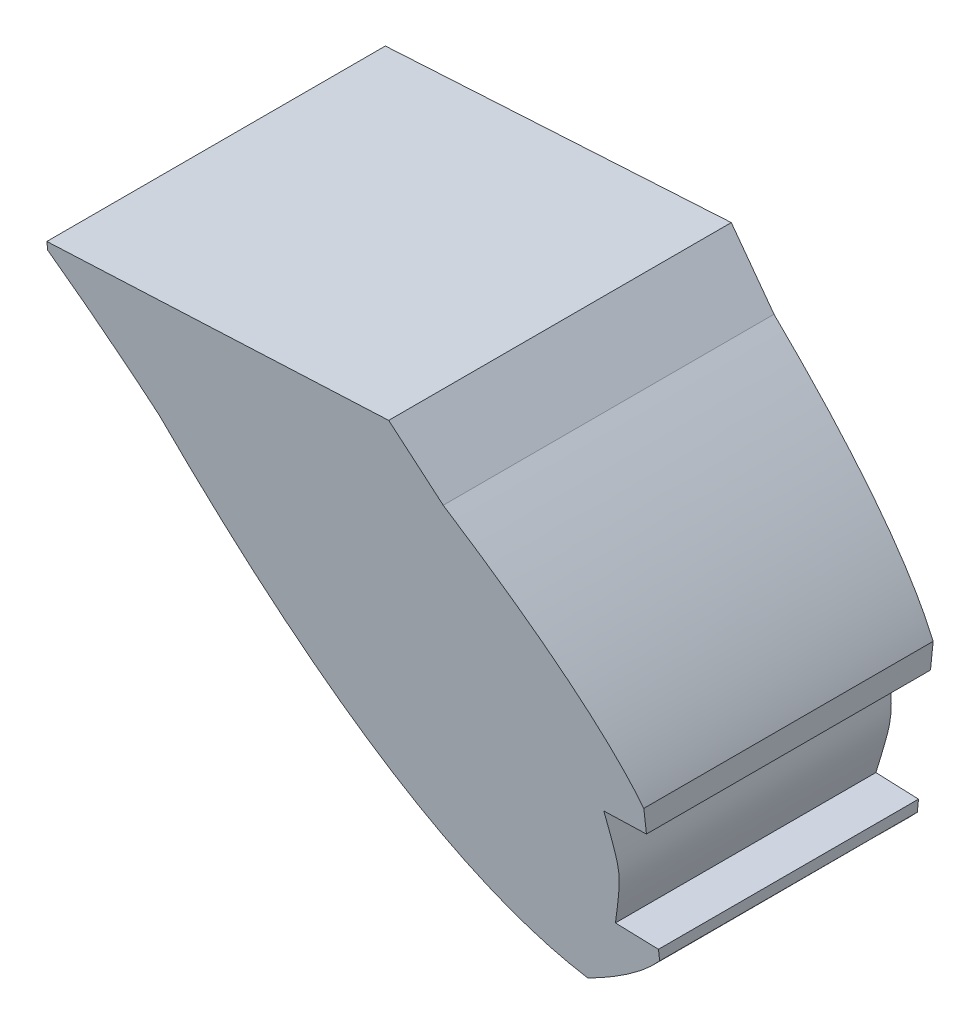
ISO-10303-21;
HEADER;
FILE_DESCRIPTION(('STEP AP214'),'2;1');
FILE_NAME('part.step','',(''),(''),'','','');
FILE_SCHEMA(('AUTOMOTIVE_DESIGN { 1 0 10303 214 1 1 1 1 }'));
ENDSEC;
DATA;
#1=APPLICATION_CONTEXT('core data for automotive mechanical design processes');
#2=APPLICATION_PROTOCOL_DEFINITION('international standard','automotive_design',2000,#1);
#3=PRODUCT_CONTEXT('',#1,'mechanical');
#4=PRODUCT('Part','Part','',(#3));
#5=PRODUCT_RELATED_PRODUCT_CATEGORY('part','',(#4));
#6=PRODUCT_DEFINITION_FORMATION('','',#4);
#7=PRODUCT_DEFINITION_CONTEXT('part definition',#1,'design');
#8=PRODUCT_DEFINITION('design','',#6,#7);
#9=PRODUCT_DEFINITION_SHAPE('','',#8);
#10=(LENGTH_UNIT() NAMED_UNIT(*) SI_UNIT(.MILLI.,.METRE.));
#11=(NAMED_UNIT(*) PLANE_ANGLE_UNIT() SI_UNIT($,.RADIAN.));
#12=(NAMED_UNIT(*) SI_UNIT($,.STERADIAN.) SOLID_ANGLE_UNIT());
#13=UNCERTAINTY_MEASURE_WITH_UNIT(LENGTH_MEASURE(1.E-05),#10,'distance_accuracy_value','');
#14=(GEOMETRIC_REPRESENTATION_CONTEXT(3) GLOBAL_UNCERTAINTY_ASSIGNED_CONTEXT((#13)) GLOBAL_UNIT_ASSIGNED_CONTEXT((#10,
#11,#12)) REPRESENTATION_CONTEXT('',''));
#15=CARTESIAN_POINT('',(0.,0.,0.));
#16=DIRECTION('',(0.,0.,1.));
#17=DIRECTION('',(1.,0.,0.));
#18=AXIS2_PLACEMENT_3D('',#15,#16,#17);
#19=CARTESIAN_POINT('',(0.355125000055651,-1.23774703808888E-13,7.));
#20=DIRECTION('',(-1.,3.48538412642003E-13,0.));
#21=DIRECTION('',(-3.48538412642003E-13,-1.,0.));
#22=AXIS2_PLACEMENT_3D('',#19,#20,#21);
#23=PLANE('',#22);
#24=DIRECTION('',(0.,-0.993653373689782,0.112485434412263));
#25=VECTOR('',#24,1.);
#26=CARTESIAN_POINT('',(0.355125000056697,12.6081551722012,-7.));
#27=LINE('',#26,#25);
#28=CARTESIAN_POINT('',(0.355125000056697,3.0015495286345,-5.91249480185305));
#29=VERTEX_POINT('',#28);
#30=CARTESIAN_POINT('',(0.355125000056447,2.03738091179555,-5.80334715682562));
#31=VERTEX_POINT('',#30);
#32=EDGE_CURVE('E60',#29,#31,#27,.T.);
#33=ORIENTED_EDGE('',*,*,#32,.F.);
#34=DIRECTION('',(0.,0.,-1.));
#35=VECTOR('',#34,1.);
#36=CARTESIAN_POINT('',(0.355125000056697,3.0015495286345,7.));
#37=LINE('',#36,#35);
#38=CARTESIAN_POINT('',(0.355125000056697,3.0015495286345,5.91249480185305));
#39=VERTEX_POINT('',#38);
#40=EDGE_CURVE('E178',#39,#29,#37,.T.);
#41=ORIENTED_EDGE('',*,*,#40,.F.);
#42=DIRECTION('',(0.,0.993653373689782,0.112485434412263));
#43=VECTOR('',#42,1.);
#44=CARTESIAN_POINT('',(0.355125000056697,12.6081551722012,7.));
#45=LINE('',#44,#43);
#46=CARTESIAN_POINT('',(0.355125000056697,2.03738091179556,5.80334715682562));
#47=VERTEX_POINT('',#46);
#48=EDGE_CURVE('E147',#47,#39,#45,.T.);
#49=ORIENTED_EDGE('',*,*,#48,.F.);
#50=DIRECTION('',(0.,0.,-1.));
#51=VECTOR('',#50,1.);
#52=CARTESIAN_POINT('',(0.355125000056447,2.03738091179555,7.));
#53=LINE('',#52,#51);
#54=EDGE_CURVE('E169',#47,#31,#53,.T.);
#55=ORIENTED_EDGE('',*,*,#54,.T.);
#56=EDGE_LOOP('',(#33,#41,#49,#55));
#57=FACE_BOUND('',#56,.T.);
#58=ADVANCED_FACE('F37',(#57),#23,.F.);
#59=CARTESIAN_POINT('',(-23.0359211456035,0.,7.));
#60=DIRECTION('',(-1.,0.,0.));
#61=DIRECTION('',(0.,0.,1.));
#62=AXIS2_PLACEMENT_3D('',#59,#60,#61);
#63=PLANE('',#62);
#64=DIRECTION('',(0.,0.,-1.));
#65=VECTOR('',#64,1.);
#66=CARTESIAN_POINT('',(-23.0359211456035,11.8716122879342,7.));
#67=LINE('',#66,#65);
#68=CARTESIAN_POINT('',(-23.0359211456035,11.8716122879342,6.91662047501294));
#69=VERTEX_POINT('',#68);
#70=CARTESIAN_POINT('',(-23.0359211456035,11.8716122879342,-6.91662047501294));
#71=VERTEX_POINT('',#70);
#72=EDGE_CURVE('E186',#69,#71,#67,.T.);
#73=ORIENTED_EDGE('',*,*,#72,.T.);
#74=DIRECTION('',(0.,-0.993653373689782,0.112485434412263));
#75=VECTOR('',#74,1.);
#76=CARTESIAN_POINT('',(-23.0359211456035,12.6081551722012,-7.));
#77=LINE('',#76,#75);
#78=CARTESIAN_POINT('',(-23.0359211456035,11.5401378200983,-6.87909627341673));
#79=VERTEX_POINT('',#78);
#80=EDGE_CURVE('E318',#71,#79,#77,.T.);
#81=ORIENTED_EDGE('',*,*,#80,.T.);
#82=DIRECTION('',(0.,0.,-1.));
#83=VECTOR('',#82,1.);
#84=CARTESIAN_POINT('',(-23.0359211456035,11.5401378200983,7.));
#85=LINE('',#84,#83);
#86=CARTESIAN_POINT('',(-23.0359211456035,11.5401378200983,6.87909627341673));
#87=VERTEX_POINT('',#86);
#88=EDGE_CURVE('E187',#87,#79,#85,.T.);
#89=ORIENTED_EDGE('',*,*,#88,.F.);
#90=DIRECTION('',(0.,0.993653373689782,0.112485434412263));
#91=VECTOR('',#90,1.);
#92=CARTESIAN_POINT('',(-23.0359211456035,12.6081551722012,7.));
#93=LINE('',#92,#91);
#94=EDGE_CURVE('E316',#87,#69,#93,.T.);
#95=ORIENTED_EDGE('',*,*,#94,.T.);
#96=EDGE_LOOP('',(#73,#81,#89,#95));
#97=FACE_BOUND('',#96,.T.);
#98=ADVANCED_FACE('F312',(#97),#63,.T.);
#99=CARTESIAN_POINT('',(-18.9451921135982,7.54091889574655,7.));
#100=CARTESIAN_POINT('',(-10.2150083842792,-3.69764410322756,7.));
#101=CARTESIAN_POINT('',(-2.84660482498738,-5.05908110388432,7.));
#102=(BOUNDED_CURVE() B_SPLINE_CURVE(2,(#99,#100,#101),.UNSPECIFIED.,.F.,
.F.) B_SPLINE_CURVE_WITH_KNOTS((3,3),(0.497667241108509,0.499554279588011),
.UNSPECIFIED.) CURVE() GEOMETRIC_REPRESENTATION_ITEM() RATIONAL_B_SPLINE_CURVE((1.,1.,1.)) REPRESENTATION_ITEM(''));
#103=DIRECTION('',(0.,0.,-1.));
#104=VECTOR('',#103,1.);
#105=SURFACE_OF_LINEAR_EXTRUSION('',#102,#104);
#106=DIRECTION('',(0.,0.,-1.));
#107=VECTOR('',#106,1.);
#108=CARTESIAN_POINT('',(-18.9451921135982,7.54091889574657,7.));
#109=LINE('',#108,#107);
#110=CARTESIAN_POINT('',(-18.9451921135982,7.54091889574657,6.42636910524442));
#111=VERTEX_POINT('',#110);
#112=CARTESIAN_POINT('',(-18.9451921135982,7.54091889574657,-6.42636910524441));
#113=VERTEX_POINT('',#112);
#114=EDGE_CURVE('E194',#111,#113,#109,.T.);
#115=ORIENTED_EDGE('',*,*,#114,.T.);
#116=CARTESIAN_POINT('',(-18.9451921135982,7.54091889574655,-6.42636910524441));
#117=CARTESIAN_POINT('',(-18.7033608655423,7.22962108931645,-6.39112898035273));
#118=CARTESIAN_POINT('',(-18.4592647140916,6.9200497206851,-6.35608429494821));
#119=CARTESIAN_POINT('',(-17.9661198805234,6.30464603742845,-6.28641819962467));
#120=CARTESIAN_POINT('',(-17.7170694462669,5.99881510969872,-6.25179694670763));
#121=CARTESIAN_POINT('',(-17.2137366178937,5.3913665824337,-6.18303140604553));
#122=CARTESIAN_POINT('',(-16.9594535947769,5.08974949683998,-6.14888717648066));
#123=CARTESIAN_POINT('',(-16.4451285665965,4.49103725761873,-6.08111061767257));
#124=CARTESIAN_POINT('',(-16.1850826962375,4.19394537928884,-6.04747865920581));
#125=CARTESIAN_POINT('',(-15.6590118901181,3.60508061675355,-5.9808168731366));
#126=CARTESIAN_POINT('',(-15.3929875534481,3.31330720485499,-5.94778698579723));
#127=CARTESIAN_POINT('',(-14.8544901847056,2.7357195544677,-5.88240181277285));
#128=CARTESIAN_POINT('',(-14.5820174931064,2.44990500284308,-5.85004649163963));
#129=CARTESIAN_POINT('',(-13.9777704357619,1.83142011947111,-5.78003159245484));
#130=CARTESIAN_POINT('',(-13.6445482479649,1.50014167377654,-5.74252958132897));
#131=CARTESIAN_POINT('',(-12.9673134934436,0.848664446736887,-5.66877982026175));
#132=CARTESIAN_POINT('',(-12.623301443116,0.528465136688492,-5.63253201046914));
#133=CARTESIAN_POINT('',(-11.9227759490938,-0.0995013958587513,-5.5614437516454));
#134=CARTESIAN_POINT('',(-11.5662405708663,-0.407244542107335,-5.52660602813964));
#135=CARTESIAN_POINT('',(-10.840142749037,-1.00720368374379,-5.45868831511867));
#136=CARTESIAN_POINT('',(-10.4705807273197,-1.29942018121482,-5.4256082687657));
#137=CARTESIAN_POINT('',(-9.71382699072171,-1.86779135556405,-5.36126643674768));
#138=CARTESIAN_POINT('',(-9.32650636654571,-2.14377746328672,-5.330023733768));
#139=CARTESIAN_POINT('',(-8.5360986768139,-2.67282289543975,-5.27013372902864));
#140=CARTESIAN_POINT('',(-8.13300835344273,-2.92587744631612,-5.24148696765387));
#141=CARTESIAN_POINT('',(-7.31201826568453,-3.40280761684766,-5.18749661363601));
#142=CARTESIAN_POINT('',(-6.89419365451789,-3.62680992502778,-5.16213867935817));
#143=CARTESIAN_POINT('',(-6.04187322097519,-4.0405536088069,-5.11530128189388));
#144=CARTESIAN_POINT('',(-5.60738935372736,-4.23031901573022,-5.09381909826786));
#145=CARTESIAN_POINT('',(-4.78985442909107,-4.54236533838515,-5.05849423842238));
#146=CARTESIAN_POINT('',(-4.4091055725695,-4.67052923075731,-5.04398558631979));
#147=CARTESIAN_POINT('',(-3.82960691198316,-4.83674345690554,-5.02516948814227));
#148=CARTESIAN_POINT('',(-3.63462104960687,-4.8878904691115,-5.01937944702812));
#149=CARTESIAN_POINT('',(-3.24229120544362,-4.9807402777546,-5.00886848683127));
#150=CARTESIAN_POINT('',(-3.0449461414238,-5.02243854990591,-5.00414807991536));
#151=CARTESIAN_POINT('',(-2.84660482498738,-5.05908110388432,-5.));
#152=B_SPLINE_CURVE_WITH_KNOTS('',3,(#116,#117,#118,#119,#120,#121,#122,#123,#124,#125,#126,
#127,#128,#129,#130,#131,#132,#133,#134,#135,#136,#137,#138,#139,#140,#141,#142,#143,#144,#145,
#146,#147,#148,#149,#150,#151),.UNSPECIFIED.,.F.,.F.,(4,2,2,2,2,2,2,2,2,2,2,2,2,2,2,2,2,4),(0.,
1.1872997216569,2.37502708567824,3.56289806807204,4.75159146291787,5.94016626761519,
7.12867845491362,8.54255640265696,9.95636678593971,11.3727907462706,12.7891688759803,
14.2183172044781,15.6477623519031,17.0707480146133,18.4927309460623,19.6971402338765,
20.3019233237111,20.9069953892921),.UNSPECIFIED.);
#153=CARTESIAN_POINT('',(-2.84660482498738,-5.05908110388432,-5.));
#154=VERTEX_POINT('',#153);
#155=EDGE_CURVE('E251',#113,#154,#152,.T.);
#156=ORIENTED_EDGE('',*,*,#155,.T.);
#157=DIRECTION('',(0.,0.,-1.));
#158=VECTOR('',#157,1.);
#159=CARTESIAN_POINT('',(-2.84660482498738,-5.05908110388432,7.));
#160=LINE('',#159,#158);
#161=CARTESIAN_POINT('',(-2.84660482498738,-5.05908110388432,5.));
#162=VERTEX_POINT('',#161);
#163=EDGE_CURVE('E154',#162,#154,#160,.T.);
#164=ORIENTED_EDGE('',*,*,#163,.F.);
#165=CARTESIAN_POINT('',(-2.84660482498738,-5.05908110388432,5.));
#166=CARTESIAN_POINT('',(-3.0836355452615,-5.01529762547054,5.00495646039138));
#167=CARTESIAN_POINT('',(-3.31925014057108,-4.96428184629726,5.01073164541478));
#168=CARTESIAN_POINT('',(-3.78628189704186,-4.84911384389608,5.02376911212451));
#169=CARTESIAN_POINT('',(-4.01771143135529,-4.78501130060695,5.03102576984815));
#170=CARTESIAN_POINT('',(-4.47638324853452,-4.64477679089168,5.04690086287615));
#171=CARTESIAN_POINT('',(-4.70363211310207,-4.56866593727755,5.05551690812791));
#172=CARTESIAN_POINT('',(-5.15398016115681,-4.40545252874729,5.07399330205617));
#173=CARTESIAN_POINT('',(-5.37708095327682,-4.31835434125152,5.08385315632366));
#174=CARTESIAN_POINT('',(-5.81545834234536,-4.13567110279715,5.10453361087802));
#175=CARTESIAN_POINT('',(-6.03080317783365,-4.04024711994086,5.11533597762798));
#176=CARTESIAN_POINT('',(-6.45748946905634,-3.84057736608456,5.13793937192646));
#177=CARTESIAN_POINT('',(-6.66882789943329,-3.73632522989765,5.14974112003892));
#178=CARTESIAN_POINT('',(-7.08747417766979,-3.51983158147829,5.17424904476877));
#179=CARTESIAN_POINT('',(-7.29477947597257,-3.40758521204135,5.18695577124062));
#180=CARTESIAN_POINT('',(-7.70530843131035,-3.17590609220346,5.21318275051655));
#181=CARTESIAN_POINT('',(-7.90853147430462,-3.0564722713248,5.22670312450288));
#182=CARTESIAN_POINT('',(-8.45410340689061,-2.72385368196738,5.26435684511426));
#183=CARTESIAN_POINT('',(-8.79259906035209,-2.50440768840731,5.28919898682003));
#184=CARTESIAN_POINT('',(-9.45845448583479,-2.04949644973372,5.3406967119384));
#185=CARTESIAN_POINT('',(-9.78581359629267,-1.81403025542841,5.3673524028032));
#186=CARTESIAN_POINT('',(-10.4302582396863,-1.32938575303013,5.42221604925302));
#187=CARTESIAN_POINT('',(-10.7473396395034,-1.08020203459831,5.45042461730948));
#188=CARTESIAN_POINT('',(-11.3718438106499,-0.570176876647104,5.50816145288252));
#189=CARTESIAN_POINT('',(-11.6792662750814,-0.309335067346119,5.53768976225981));
#190=CARTESIAN_POINT('',(-12.2887351366992,0.225514030316342,5.59823676455314));
#191=CARTESIAN_POINT('',(-12.5906756597182,0.499640146613562,5.62926890925461));
#192=CARTESIAN_POINT('',(-13.1859914625247,1.05668157973797,5.69232817041119));
#193=CARTESIAN_POINT('',(-13.4793699933214,1.33959347409339,5.72435489942917));
#194=CARTESIAN_POINT('',(-14.0582984741035,1.91313890151101,5.78928247705987));
#195=CARTESIAN_POINT('',(-14.3438493181123,2.20377154523463,5.82218322499598));
#196=CARTESIAN_POINT('',(-14.9077244427009,2.7918210558895,5.88875272137508));
#197=CARTESIAN_POINT('',(-15.1860493084316,3.08923736980037,5.92242140721399));
#198=CARTESIAN_POINT('',(-15.7683607406539,3.72540309630891,5.99443784674841));
#199=CARTESIAN_POINT('',(-16.0715178451228,4.06490144250158,6.03287038264566));
#200=CARTESIAN_POINT('',(-16.6701836985208,4.7504922746204,6.11048193675692));
#201=CARTESIAN_POINT('',(-16.9656923307507,5.09658486102068,6.14966096634501));
#202=CARTESIAN_POINT('',(-17.4495199616275,5.67490501691598,6.21512906184765));
#203=CARTESIAN_POINT('',(-17.6398456690967,5.90547984199544,6.24123103065322));
#204=CARTESIAN_POINT('',(-18.0176052393411,6.36895711711416,6.29369846448112));
#205=CARTESIAN_POINT('',(-18.205039097963,6.60185957049552,6.3200639298818));
#206=CARTESIAN_POINT('',(-18.5771476687389,7.06981539005112,6.37303835239394));
#207=CARTESIAN_POINT('',(-18.7618224957771,7.30486866600559,6.39964729929217));
#208=CARTESIAN_POINT('',(-18.9451921135982,7.54091889574655,6.42636910524441));
#209=B_SPLINE_CURVE_WITH_KNOTS('',3,(#165,#166,#167,#168,#169,#170,#171,#172,#173,#174,#175,
#176,#177,#178,#179,#180,#181,#182,#183,#184,#185,#186,#187,#188,#189,#190,#191,#192,#193,#194,
#195,#196,#197,#198,#199,#200,#201,#202,#203,#204,#205,#206,#207,#208),.UNSPECIFIED.,.F.,.F.,(4,
2,2,2,2,2,2,2,2,2,2,2,2,2,2,2,2,2,2,2,2,4),(0.,0.723070627629283,1.44344574109941,
2.16256813451498,2.88140557514503,3.58855192345824,4.2962125448096,5.0043068623572,
5.71250690363926,6.92441762508089,8.13640021448464,9.3488642962315,10.5613668633146,
11.788141520998,13.0144441434254,14.2406061176645,15.4666684871313,16.8368576095009,
18.2070676256843,19.1073954524656,20.0077245721621,20.9080160976373),.UNSPECIFIED.);
#210=EDGE_CURVE('E133',#162,#111,#209,.T.);
#211=ORIENTED_EDGE('',*,*,#210,.T.);
#212=EDGE_LOOP('',(#115,#156,#164,#211));
#213=FACE_BOUND('',#212,.T.);
#214=ADVANCED_FACE('F45',(#213),#105,.F.);
#215=CARTESIAN_POINT('',(-2.84660482498738,-5.05908110388432,7.));
#216=CARTESIAN_POINT('',(-0.742366881974002,-3.93520659958673,7.));
#217=CARTESIAN_POINT('',(0.355124999965198,-2.72325322699678,7.));
#218=(BOUNDED_CURVE() B_SPLINE_CURVE(2,(#215,#216,#217),.UNSPECIFIED.,.F.,
.F.) B_SPLINE_CURVE_WITH_KNOTS((3,3),(0.498812074629495,0.499412845463797),
.UNSPECIFIED.) CURVE() GEOMETRIC_REPRESENTATION_ITEM() RATIONAL_B_SPLINE_CURVE((1.,1.,1.)) REPRESENTATION_ITEM(''));
#219=DIRECTION('',(0.,0.,-1.));
#220=VECTOR('',#219,1.);
#221=SURFACE_OF_LINEAR_EXTRUSION('',#218,#220);
#222=ORIENTED_EDGE('',*,*,#163,.T.);
#223=CARTESIAN_POINT('',(-2.84660482498738,-5.05908110388432,-5.));
#224=CARTESIAN_POINT('',(-2.67154367534484,-4.96554243060771,-5.01058894235803));
#225=CARTESIAN_POINT('',(-2.49778385523126,-4.86952307483158,-5.02145870764284));
#226=CARTESIAN_POINT('',(-2.15332890723938,-4.67164155861341,-5.04385966647148));
#227=CARTESIAN_POINT('',(-1.9826387176766,-4.56977092703724,-5.05539181898071));
#228=CARTESIAN_POINT('',(-1.64527137465746,-4.35955519460265,-5.0791890591545));
#229=CARTESIAN_POINT('',(-1.47859514121983,-4.25120862887406,-5.09145431264808));
#230=CARTESIAN_POINT('',(-1.15044448784201,-4.02724001195876,-5.11680843294344));
#231=CARTESIAN_POINT('',(-0.98896568487432,-3.911624347545,-5.12989657673763));
#232=CARTESIAN_POINT('',(-0.724614348138144,-3.7114805449727,-5.15255363519824));
#233=CARTESIAN_POINT('',(-0.619967455079453,-3.6292658395869,-5.16186066025876));
#234=CARTESIAN_POINT('',(-0.414118763296717,-3.46070156785231,-5.18094279275538));
#235=CARTESIAN_POINT('',(-0.312916415666604,-3.3743526656372,-5.19071782500895));
#236=CARTESIAN_POINT('',(-0.114288127047668,-3.19685300163986,-5.21081147873311));
#237=CARTESIAN_POINT('',(-0.0168745915935635,-3.10568844995875,-5.221131661274));
#238=CARTESIAN_POINT('',(0.173044677325634,-2.91833195578561,-5.24234114658855));
#239=CARTESIAN_POINT('',(0.265547074526193,-2.82213668167119,-5.25323082651485));
#240=CARTESIAN_POINT('',(0.355124999965198,-2.72325322699678,-5.26442481895704));
#241=B_SPLINE_CURVE_WITH_KNOTS('',3,(#223,#224,#225,#226,#227,#228,#229,#230,#231,#232,#233,
#234,#235,#236,#237,#238,#239,#240),.UNSPECIFIED.,.F.,.F.,(4,2,2,2,2,2,2,2,4),(0.,
0.596333361221147,1.19355295493407,1.79090815604603,2.38774565156578,2.78786762990545,
3.18792554534165,3.58919872466333,3.99074110013676),.UNSPECIFIED.);
#242=CARTESIAN_POINT('',(0.355125000010947,-2.72325322699678,-5.26442481895704));
#243=VERTEX_POINT('',#242);
#244=EDGE_CURVE('E152',#154,#243,#241,.T.);
#245=ORIENTED_EDGE('',*,*,#244,.T.);
#246=DIRECTION('',(0.,0.,-1.));
#247=VECTOR('',#246,1.);
#248=CARTESIAN_POINT('',(0.355124999965198,-2.72325322699678,7.));
#249=LINE('',#248,#247);
#250=CARTESIAN_POINT('',(0.355125000010947,-2.72325322699678,5.26442481895704));
#251=VERTEX_POINT('',#250);
#252=EDGE_CURVE('E148',#251,#243,#249,.T.);
#253=ORIENTED_EDGE('',*,*,#252,.F.);
#254=CARTESIAN_POINT('',(0.355124999965198,-2.72325322699678,5.26442481895704));
#255=CARTESIAN_POINT('',(0.288265800066398,-2.79707578870119,5.25606781726749));
#256=CARTESIAN_POINT('',(0.219762299322532,-2.86939557158838,5.24788093599675));
#257=CARTESIAN_POINT('',(0.0798741499126208,-3.0111837154317,5.23182996553057));
#258=CARTESIAN_POINT('',(0.00849051694650469,-3.08065306448068,5.22396576447915));
#259=CARTESIAN_POINT('',(-0.209110404202349,-3.28478130911614,5.20085765164865));
#260=CARTESIAN_POINT('',(-0.359086186155244,-3.41549544786354,5.18606030171743));
#261=CARTESIAN_POINT('',(-0.666431647279958,-3.66745151891472,5.15753789253991));
#262=CARTESIAN_POINT('',(-0.823790135326829,-3.78870709059741,5.14381128926277));
#263=CARTESIAN_POINT('',(-1.14463764434189,-4.02329424679429,5.11725510893767));
#264=CARTESIAN_POINT('',(-1.30813354467851,-4.13661650521983,5.10442658763929));
#265=CARTESIAN_POINT('',(-1.58497175174893,-4.31986712055689,5.08368190381061));
#266=CARTESIAN_POINT('',(-1.69701528140079,-4.39175032218513,5.07554444523986));
#267=CARTESIAN_POINT('',(-1.92294333828473,-4.53261962763427,5.05959749086083));
#268=CARTESIAN_POINT('',(-2.03682799400811,-4.6016055280346,5.05178801808056));
#269=CARTESIAN_POINT('',(-2.26591352019373,-4.73675126913538,5.03648899349189));
#270=CARTESIAN_POINT('',(-2.38111062922232,-4.80291742324192,5.02899872698133));
#271=CARTESIAN_POINT('',(-2.6128736149529,-4.93278949726635,5.01429670205848));
#272=CARTESIAN_POINT('',(-2.72943923096306,-4.99649587614853,5.00708489168965));
#273=CARTESIAN_POINT('',(-2.84660482498738,-5.05908110388432,5.));
#274=B_SPLINE_CURVE_WITH_KNOTS('',3,(#254,#255,#256,#257,#258,#259,#260,#261,#262,#263,#264,
#265,#266,#267,#268,#269,#270,#271,#272,#273),.UNSPECIFIED.,.F.,.F.,(4,2,2,2,2,2,2,2,2,4),(0.,
0.299782926841572,0.599461041577767,1.1974499434567,1.79455995327913,2.39236050766276,
2.79242459253001,3.19251671924541,3.59166012626068,3.99072869445439),.UNSPECIFIED.);
#275=EDGE_CURVE('E126',#251,#162,#274,.T.);
#276=ORIENTED_EDGE('',*,*,#275,.T.);
#277=EDGE_LOOP('',(#222,#245,#253,#276));
#278=FACE_BOUND('',#277,.T.);
#279=ADVANCED_FACE('F153',(#278),#221,.F.);
#280=CARTESIAN_POINT('',(0.355125000532009,-7.39148800447813E-11,7.));
#281=DIRECTION('',(1.,-2.08137641489758E-10,0.));
#282=DIRECTION('',(2.08137641489758E-10,1.,0.));
#283=AXIS2_PLACEMENT_3D('',#280,#281,#282);
#284=PLANE('',#283);
#285=CARTESIAN_POINT('',(0.355125000056697,-2.28484178142546,-5.31405470319249));
#286=VERTEX_POINT('',#285);
#287=EDGE_CURVE('E149',#286,#243,#27,.T.);
#288=ORIENTED_EDGE('',*,*,#287,.F.);
#289=DIRECTION('',(0.,0.,-1.));
#290=VECTOR('',#289,1.);
#291=CARTESIAN_POINT('',(0.355125000056447,-2.28484178142545,7.));
#292=LINE('',#291,#290);
#293=CARTESIAN_POINT('',(0.355125000056697,-2.28484178142546,5.31405470319249));
#294=VERTEX_POINT('',#293);
#295=EDGE_CURVE('E146',#294,#286,#292,.T.);
#296=ORIENTED_EDGE('',*,*,#295,.F.);
#297=EDGE_CURVE('E134',#251,#294,#45,.T.);
#298=ORIENTED_EDGE('',*,*,#297,.F.);
#299=ORIENTED_EDGE('',*,*,#252,.T.);
#300=EDGE_LOOP('',(#288,#296,#298,#299));
#301=FACE_BOUND('',#300,.T.);
#302=ADVANCED_FACE('F144',(#301),#284,.T.);
#303=CARTESIAN_POINT('',(-0.0792587195419091,-2.26967276768239,7.));
#304=DIRECTION('',(-0.0348994967024901,-0.999390827019096,0.));
#305=DIRECTION('',(0.999390827019096,-0.0348994967024901,0.));
#306=AXIS2_PLACEMENT_3D('',#303,#304,#305);
#307=PLANE('',#306);
#308=ORIENTED_EDGE('',*,*,#295,.T.);
#309=DIRECTION('',(-0.999383027616045,0.034899224341334,-0.00395072820626436));
#310=VECTOR('',#309,1.);
#311=CARTESIAN_POINT('',(-0.0306324717090319,-2.27137083367421,-5.31557966697752));
#312=LINE('',#311,#310);
#313=CARTESIAN_POINT('',(-1.39487499994356,-2.22373043481491,-5.32097274579469));
#314=VERTEX_POINT('',#313);
#315=EDGE_CURVE('E298',#286,#314,#312,.T.);
#316=ORIENTED_EDGE('',*,*,#315,.T.);
#317=DIRECTION('',(0.,0.,-1.));
#318=VECTOR('',#317,1.);
#319=CARTESIAN_POINT('',(-1.39487499994356,-2.22373043481491,7.));
#320=LINE('',#319,#318);
#321=CARTESIAN_POINT('',(-1.39487499994356,-2.22373043481491,5.3209727457947));
#322=VERTEX_POINT('',#321);
#323=EDGE_CURVE('E158',#322,#314,#320,.T.);
#324=ORIENTED_EDGE('',*,*,#323,.F.);
#325=DIRECTION('',(0.999383027616045,-0.034899224341334,-0.00395072820626436));
#326=VECTOR('',#325,1.);
#327=CARTESIAN_POINT('',(-0.0859085417339361,-2.26944055077446,5.31579818252456));
#328=LINE('',#327,#326);
#329=EDGE_CURVE('E321',#322,#294,#328,.T.);
#330=ORIENTED_EDGE('',*,*,#329,.T.);
#331=EDGE_LOOP('',(#308,#316,#324,#330));
#332=FACE_BOUND('',#331,.T.);
#333=ADVANCED_FACE('F335',(#332),#307,.F.);
#334=CARTESIAN_POINT('',(-1.39487499994356,-2.22373043481491,7.));
#335=CARTESIAN_POINT('',(-0.907530669798052,-0.123730434814926,7.));
#336=CARTESIAN_POINT('',(-1.39487499994356,1.976269565185,7.));
#337=(BOUNDED_CURVE() B_SPLINE_CURVE(2,(#334,#335,#336),.UNSPECIFIED.,.F.,
.F.) B_SPLINE_CURVE_WITH_KNOTS((3,3),(0.,1.),
.UNSPECIFIED.) CURVE() GEOMETRIC_REPRESENTATION_ITEM() RATIONAL_B_SPLINE_CURVE((1.,
3.23180121851367,1.)) REPRESENTATION_ITEM(''));
#338=DIRECTION('',(0.,0.,-1.));
#339=VECTOR('',#338,1.);
#340=SURFACE_OF_LINEAR_EXTRUSION('',#337,#339);
#341=ORIENTED_EDGE('',*,*,#323,.T.);
#342=CARTESIAN_POINT('',(-1.39487499994356,-2.22373043481491,-5.32097274579469));
#343=CARTESIAN_POINT('',(-1.38202447122813,-2.16835021356968,-5.32724200266994));
#344=CARTESIAN_POINT('',(-1.36921744547373,-2.11295996104296,-5.33351239512535));
#345=CARTESIAN_POINT('',(-1.34371955909939,-2.00215267308472,-5.34605621196536));
#346=CARTESIAN_POINT('',(-1.33102869927897,-1.94673563747162,-5.35232963637053));
#347=CARTESIAN_POINT('',(-1.30579250980865,-1.83586894873068,-5.36488017761064));
#348=CARTESIAN_POINT('',(-1.29324717983284,-1.78041929567618,-5.37115729443729));
#349=CARTESIAN_POINT('',(-1.26834035470031,-1.66945670178657,-5.383718692514));
#350=CARTESIAN_POINT('',(-1.25597893242913,-1.61394374477822,-5.39000297559494));
#351=CARTESIAN_POINT('',(-1.23150428056634,-1.50286329328951,-5.40257771561119));
#352=CARTESIAN_POINT('',(-1.21939105277074,-1.44729579841754,-5.40886817259083));
#353=CARTESIAN_POINT('',(-1.19550012207595,-1.33608743052918,-5.42145739324204));
#354=CARTESIAN_POINT('',(-1.1837224309966,-1.2804465549999,-5.42775615719808));
#355=CARTESIAN_POINT('',(-1.15485704104805,-1.14125615214793,-5.44351305326002));
#356=CARTESIAN_POINT('',(-1.13805530724695,-1.05764770999797,-5.45297785475397));
#357=CARTESIAN_POINT('',(-1.10616760722362,-0.890046794372653,-5.47195093158457));
#358=CARTESIAN_POINT('',(-1.09108267359643,-0.806054121054038,-5.48145922954426));
#359=CARTESIAN_POINT('',(-1.06839764881353,-0.664871544058104,-5.49744164748328));
#360=CARTESIAN_POINT('',(-1.05995626751594,-0.607817685780514,-5.50390036659317));
#361=CARTESIAN_POINT('',(-1.04516806244473,-0.493450404650503,-5.51684718853439));
#362=CARTESIAN_POINT('',(-1.03882061818002,-0.436137063802354,-5.52333528208253));
#363=CARTESIAN_POINT('',(-1.02903068414648,-0.321308074689071,-5.53633437116685));
#364=CARTESIAN_POINT('',(-1.02558541499307,-0.263792673078833,-5.54284533878074));
#365=CARTESIAN_POINT('',(-1.02222407231355,-0.148714957691158,-5.55587258464867));
#366=CARTESIAN_POINT('',(-1.02230420900467,-0.0911527608046732,-5.56238884967019));
#367=CARTESIAN_POINT('',(-1.02596900528622,0.0239015023985966,-5.57541344065945));
#368=CARTESIAN_POINT('',(-1.02955657044098,0.0813934710005595,-5.58192175556548));
#369=CARTESIAN_POINT('',(-1.03959132289802,0.196133385303809,-5.59491076103416));
#370=CARTESIAN_POINT('',(-1.04603929917214,0.253381259276288,-5.60139144347683));
#371=CARTESIAN_POINT('',(-1.05997220439613,0.35983137212623,-5.6134420111136));
#372=CARTESIAN_POINT('',(-1.06719667195452,0.409068491171902,-5.61901584487869));
#373=CARTESIAN_POINT('',(-1.08274764683563,0.507347946837772,-5.63014146227917));
#374=CARTESIAN_POINT('',(-1.0910737056158,0.556390354412903,-5.63569325394695));
#375=CARTESIAN_POINT('',(-1.10853037258208,0.654424381213792,-5.64679108784343));
#376=CARTESIAN_POINT('',(-1.11766242226862,0.703415744133191,-5.65233710105724));
#377=CARTESIAN_POINT('',(-1.1364977866421,0.801294033672847,-5.6634173048888));
#378=CARTESIAN_POINT('',(-1.14620115522269,0.850180949988233,-5.66895149433999));
#379=CARTESIAN_POINT('',(-1.16833495400599,0.959258362431623,-5.68129948252998));
#380=CARTESIAN_POINT('',(-1.1808737668477,1.01942705832357,-5.68811081339709));
#381=CARTESIAN_POINT('',(-1.20639174214038,1.13967062360228,-5.70172285360526));
#382=CARTESIAN_POINT('',(-1.21937089694786,1.19974549459873,-5.70852356312855));
#383=CARTESIAN_POINT('',(-1.24564626429316,1.31982703510014,-5.72211726150049));
#384=CARTESIAN_POINT('',(-1.2589424791072,1.37983370411223,-5.72891025029334));
#385=CARTESIAN_POINT('',(-1.28569888355067,1.49948275843749,-5.74245498954463));
#386=CARTESIAN_POINT('',(-1.29915785770072,1.55912541262012,-5.74920677044014));
#387=CARTESIAN_POINT('',(-1.32625009614692,1.67837055204035,-5.76270578495002));
#388=CARTESIAN_POINT('',(-1.33988335761136,1.73797303791406,-5.76945301863641));
#389=CARTESIAN_POINT('',(-1.36728618039678,1.85714403003134,-5.78294363938264));
#390=CARTESIAN_POINT('',(-1.381055735056,1.91671253778666,-5.7896870266136));
#391=CARTESIAN_POINT('',(-1.39487499994356,1.976269565185,-5.79642911422342));
#392=B_SPLINE_CURVE_WITH_KNOTS('',3,(#342,#343,#344,#345,#346,#347,#348,#349,#350,#351,#352,
#353,#354,#355,#356,#357,#358,#359,#360,#361,#362,#363,#364,#365,#366,#367,#368,#369,#370,#371,
#372,#373,#374,#375,#376,#377,#378,#379,#380,#381,#382,#383,#384,#385,#386,#387,#388,#389,#390,
#391),.UNSPECIFIED.,.F.,.F.,(4,2,2,2,2,2,2,2,2,2,2,2,2,2,2,2,2,2,2,2,2,2,2,2,4),(0.,
0.171588763273453,0.343178706622211,0.514768265617104,0.686424107910212,0.858081191922478,
1.02974431538338,1.28714724145325,1.54470417716685,1.71878537631805,1.8928149439917,
2.06667765516018,2.24035346989174,2.41417328020677,2.58804106414591,2.73825198714263,
2.88840193486919,3.03882608638502,3.18926445051695,3.37477476712053,3.56028186526787,
3.74579029559563,3.93033206952695,4.11487084894101,4.29940065253389),.UNSPECIFIED.);
#393=CARTESIAN_POINT('',(-1.39487499994356,1.976269565185,-5.79642911422342));
#394=VERTEX_POINT('',#393);
#395=EDGE_CURVE('E172',#314,#394,#392,.T.);
#396=ORIENTED_EDGE('',*,*,#395,.T.);
#397=DIRECTION('',(0.,0.,-1.));
#398=VECTOR('',#397,1.);
#399=CARTESIAN_POINT('',(-1.39487499994356,1.976269565185,7.));
#400=LINE('',#399,#398);
#401=CARTESIAN_POINT('',(-1.39487499994356,1.976269565185,5.79642911422342));
#402=VERTEX_POINT('',#401);
#403=EDGE_CURVE('E167',#402,#394,#400,.T.);
#404=ORIENTED_EDGE('',*,*,#403,.F.);
#405=CARTESIAN_POINT('',(-1.39487499994356,1.976269565185,5.79642911422342));
#406=CARTESIAN_POINT('',(-1.37907511533365,1.90817072448153,5.78872006005792));
#407=CARTESIAN_POINT('',(-1.36333836969219,1.84005724657732,5.78100934890426));
#408=CARTESIAN_POINT('',(-1.33204781411177,1.703774616767,5.76558162408294));
#409=CARTESIAN_POINT('',(-1.31649404111311,1.63560545649229,5.75786460946793));
#410=CARTESIAN_POINT('',(-1.28563112684324,1.49920642241426,5.74242370722985));
#411=CARTESIAN_POINT('',(-1.27032200601989,1.43097654403409,5.73469981908867));
#412=CARTESIAN_POINT('',(-1.2399275173513,1.29390485970128,5.71918277022027));
#413=CARTESIAN_POINT('',(-1.22484485449072,1.22506245970345,5.71138954224482));
#414=CARTESIAN_POINT('',(-1.19518112320204,1.0872751663326,5.69579148364441));
#415=CARTESIAN_POINT('',(-1.18060002365467,1.01833027959621,5.68798665377074));
#416=CARTESIAN_POINT('',(-1.1521828568661,0.880291295746957,5.67236010282727));
#417=CARTESIAN_POINT('',(-1.13834675067045,0.81119720663251,5.66453838266293));
#418=CARTESIAN_POINT('',(-1.11516473949854,0.690174385789182,5.65083812768789));
#419=CARTESIAN_POINT('',(-1.10556404533104,0.638294159941606,5.64496508393199));
#420=CARTESIAN_POINT('',(-1.08728934318226,0.534373551286744,5.6332008660282));
#421=CARTESIAN_POINT('',(-1.07861528667302,0.482333177013413,5.62730969284637));
#422=CARTESIAN_POINT('',(-1.06260440200736,0.378149691610768,5.61551571627023));
#423=CARTESIAN_POINT('',(-1.05526500549272,0.326006977236309,5.60961295779011));
#424=CARTESIAN_POINT('',(-1.04244257361275,0.221494061638693,5.59778168843203));
#425=CARTESIAN_POINT('',(-1.03695934618146,0.169123884520429,5.59185318028283));
#426=CARTESIAN_POINT('',(-1.02917052981484,0.0729301509045448,5.58096367474698));
#427=CARTESIAN_POINT('',(-1.02648754730517,0.0291375389214666,5.57600618039996));
#428=CARTESIAN_POINT('',(-1.02311803398459,-0.0585228047861236,5.56608268785843));
#429=CARTESIAN_POINT('',(-1.02243133042271,-0.10239052968188,5.56111669043696));
#430=CARTESIAN_POINT('',(-1.02313587995194,-0.190112899664059,5.55118617627941));
#431=CARTESIAN_POINT('',(-1.02452732528276,-0.233967543165022,5.54622165972282));
#432=CARTESIAN_POINT('',(-1.02922830316647,-0.321575626235211,5.53630408328911));
#433=CARTESIAN_POINT('',(-1.03253802615093,-0.365329055323649,5.53135102459847));
#434=CARTESIAN_POINT('',(-1.04481913269156,-0.496026010219698,5.51655561994619));
#435=CARTESIAN_POINT('',(-1.05614963950478,-0.582745183351363,5.50673867158183));
#436=CARTESIAN_POINT('',(-1.08246686740171,-0.755641929816293,5.48716608606103));
#437=CARTESIAN_POINT('',(-1.09745579058543,-0.84181914476287,5.47741048947536));
#438=CARTESIAN_POINT('',(-1.129420439335,-1.01366509487317,5.45795685819712));
#439=CARTESIAN_POINT('',(-1.14639302616418,-1.09933441387988,5.44825875741124));
#440=CARTESIAN_POINT('',(-1.18149622255001,-1.27039766561497,5.42889373063944));
#441=CARTESIAN_POINT('',(-1.19962634896168,-1.35579169781193,5.41922679339328));
#442=CARTESIAN_POINT('',(-1.24641099322308,-1.57177275123237,5.39477689641502));
#443=CARTESIAN_POINT('',(-1.2755379218154,-1.70225834502177,5.38000541866374));
#444=CARTESIAN_POINT('',(-1.31987060164556,-1.89787014932725,5.35786140006925));
#445=CARTESIAN_POINT('',(-1.33475842772637,-1.96306843680887,5.35048069983263));
#446=CARTESIAN_POINT('',(-1.36470186719661,-2.09342597092531,5.33572371893541));
#447=CARTESIAN_POINT('',(-1.37975747811874,-2.15858521811941,5.32834743821149));
#448=CARTESIAN_POINT('',(-1.39487499994356,-2.22373043481491,5.3209727457947));
#449=B_SPLINE_CURVE_WITH_KNOTS('',3,(#405,#406,#407,#408,#409,#410,#411,#412,#413,#414,#415,
#416,#417,#418,#419,#420,#421,#422,#423,#424,#425,#426,#427,#428,#429,#430,#431,#432,#433,#434,
#435,#436,#437,#438,#439,#440,#441,#442,#443,#444,#445,#446,#447,#448),.UNSPECIFIED.,.F.,.F.,(4,
2,2,2,2,2,2,2,2,2,2,2,2,2,2,2,2,2,2,2,2,4),(0.,0.210994688118994,0.422031267037357,
0.633085392962154,0.845798629208893,1.05849864386888,1.27118752598179,1.4304428147189,
1.58968975917224,1.7486269361582,1.90754766218714,2.03996993828288,2.1723807546786,
2.30480382052941,2.43724003455642,2.70109168787962,2.96510255404672,3.22870119353187,
3.49219051999256,3.89571487778355,4.09756249770236,4.29940715332609),.UNSPECIFIED.);
#450=EDGE_CURVE('E63',#402,#322,#449,.T.);
#451=ORIENTED_EDGE('',*,*,#450,.T.);
#452=EDGE_LOOP('',(#341,#396,#404,#451));
#453=FACE_BOUND('',#452,.T.);
#454=ADVANCED_FACE('F175',(#453),#340,.F.);
#455=CARTESIAN_POINT('',(0.355125000056697,3.0015495286345,7.));
#456=CARTESIAN_POINT('',(-1.44872627004384,6.0584273141466,7.));
#457=CARTESIAN_POINT('',(-6.99487502582887,10.4773899922143,7.));
#458=(BOUNDED_CURVE() B_SPLINE_CURVE(2,(#455,#456,#457),.UNSPECIFIED.,.F.,
.F.) B_SPLINE_CURVE_WITH_KNOTS((3,3),(0.500820705122982,0.502013311782223),
.UNSPECIFIED.) CURVE() GEOMETRIC_REPRESENTATION_ITEM() RATIONAL_B_SPLINE_CURVE((1.,1.,1.)) REPRESENTATION_ITEM(''));
#459=DIRECTION('',(0.,0.,-1.));
#460=VECTOR('',#459,1.);
#461=SURFACE_OF_LINEAR_EXTRUSION('',#458,#460);
#462=ORIENTED_EDGE('',*,*,#40,.T.);
#463=CARTESIAN_POINT('',(0.355125000056697,3.0015495286345,-5.91249480185305));
#464=CARTESIAN_POINT('',(0.304611825062614,3.08713910892722,-5.92218387590574));
#465=CARTESIAN_POINT('',(0.252829574975965,3.17197675667728,-5.93178782826414));
#466=CARTESIAN_POINT('',(0.146996425684332,3.34022678950728,-5.95083438769209));
#467=CARTESIAN_POINT('',(0.092945870986308,3.42363938833331,-5.96027701895852));
#468=CARTESIAN_POINT('',(-0.0720259816016992,3.67159280703978,-5.9883463122913));
#469=CARTESIAN_POINT('',(-0.185954424573863,3.83416207979728,-6.00674978753972));
#470=CARTESIAN_POINT('',(-0.420195702371685,4.15456473361426,-6.04302061663943));
#471=CARTESIAN_POINT('',(-0.540506139916056,4.3123998585806,-6.06088816790776));
#472=CARTESIAN_POINT('',(-0.785880610008438,4.62328354155297,-6.09608141241009));
#473=CARTESIAN_POINT('',(-0.910922246407595,4.77634960365364,-6.11340908717582));
#474=CARTESIAN_POINT('',(-1.16542402575789,5.0789091469452,-6.14766000662507));
#475=CARTESIAN_POINT('',(-1.29488601263671,5.22840109188721,-6.16458307739923));
#476=CARTESIAN_POINT('',(-1.55752786665308,5.52415387167798,-6.19806344469258));
#477=CARTESIAN_POINT('',(-1.6907082385264,5.67041426299934,-6.21462069100275));
#478=CARTESIAN_POINT('',(-1.95676457683924,5.9562751983388,-6.24698126295326));
#479=CARTESIAN_POINT('',(-2.08955967948613,6.0959502005499,-6.26279301755123));
#480=CARTESIAN_POINT('',(-2.35774738083663,6.37276289931955,-6.29412929385883));
#481=CARTESIAN_POINT('',(-2.49313949667974,6.50990105841303,-6.30965386792921));
#482=CARTESIAN_POINT('',(-2.76622057988734,6.78188630008672,-6.34044365727978));
#483=CARTESIAN_POINT('',(-2.90390945120438,6.91673347799924,-6.35570888335196));
#484=CARTESIAN_POINT('',(-3.18157989443261,7.18458262668443,-6.38603045085686));
#485=CARTESIAN_POINT('',(-3.32156519397778,7.31758077815757,-6.40108635992999));
#486=CARTESIAN_POINT('',(-3.60336702010312,7.58165632334332,-6.4309807408121));
#487=CARTESIAN_POINT('',(-3.74518361420142,7.7127336458542,-6.44581920456076));
#488=CARTESIAN_POINT('',(-4.03045824598403,7.9731143136119,-6.47529531091817));
#489=CARTESIAN_POINT('',(-4.17391630095381,8.10241764014601,-6.48993295140857));
#490=CARTESIAN_POINT('',(-4.46327774044283,8.36024031964194,-6.51911948352564));
#491=CARTESIAN_POINT('',(-4.60919106044248,8.48874865574429,-6.53366712800089));
#492=CARTESIAN_POINT('',(-4.902378301708,8.74421850432193,-6.56258731048845));
#493=CARTESIAN_POINT('',(-5.04965220356223,8.87118003880593,-6.57695985099224));
#494=CARTESIAN_POINT('',(-5.34544402422969,9.12366570876955,-6.60554221283062));
#495=CARTESIAN_POINT('',(-5.4939619526495,9.24918983313146,-6.61975203290664));
#496=CARTESIAN_POINT('',(-5.79168814535511,9.49851914833085,-6.64797708308463));
#497=CARTESIAN_POINT('',(-5.94089298845833,9.62232837448879,-6.66199277000059));
#498=CARTESIAN_POINT('',(-6.24034209654586,9.86869525036086,-6.68988246050136));
#499=CARTESIAN_POINT('',(-6.39058634943962,9.99125291459239,-6.70375646572961));
#500=CARTESIAN_POINT('',(-6.69203115149199,10.2351870903959,-6.7313707651018));
#501=CARTESIAN_POINT('',(-6.84323165475483,10.356563657956,-6.74511106558381));
#502=CARTESIAN_POINT('',(-6.99487502582887,10.4773899922143,-6.75878907751167));
#503=B_SPLINE_CURVE_WITH_KNOTS('',3,(#463,#464,#465,#466,#467,#468,#469,#470,#471,#472,#473,
#474,#475,#476,#477,#478,#479,#480,#481,#482,#483,#484,#485,#486,#487,#488,#489,#490,#491,#492,
#493,#494,#495,#496,#497,#498,#499,#500,#501,#502),.UNSPECIFIED.,.F.,.F.,(4,2,2,2,2,2,2,2,2,2,2,
2,2,2,2,2,2,2,2,4),(0.,0.299537168074909,0.599029006346325,1.19691549709242,1.7945789713371,
2.38970027938851,2.98507294745423,3.58052682848059,4.16061190167034,4.74059014597745,
5.32054419682563,5.9015573265281,6.48259193915569,7.06363267602949,7.64855709920549,
8.23347319002028,8.81839380183376,9.40155465760286,9.98470874134178,10.5678350455167),.UNSPECIFIED.);
#504=CARTESIAN_POINT('',(-6.99487502582887,10.4773899922143,-6.75878907751168));
#505=VERTEX_POINT('',#504);
#506=EDGE_CURVE('E230',#29,#505,#503,.T.);
#507=ORIENTED_EDGE('',*,*,#506,.T.);
#508=DIRECTION('',(0.,0.,-1.));
#509=VECTOR('',#508,1.);
#510=CARTESIAN_POINT('',(-6.99487502582887,10.4773899922143,7.));
#511=LINE('',#510,#509);
#512=CARTESIAN_POINT('',(-6.99487502582887,10.4773899922143,6.75878907751167));
#513=VERTEX_POINT('',#512);
#514=EDGE_CURVE('E177',#513,#505,#511,.T.);
#515=ORIENTED_EDGE('',*,*,#514,.F.);
#516=CARTESIAN_POINT('',(-6.99487502582887,10.4773899922143,6.75878907751167));
#517=CARTESIAN_POINT('',(-6.8413729328842,10.3550825633836,6.74494339990603));
#518=CARTESIAN_POINT('',(-6.68832454473299,10.2322113968793,6.73103390499871));
#519=CARTESIAN_POINT('',(-6.38320800729791,9.98525754721245,6.70307776677679));
#520=CARTESIAN_POINT('',(-6.23113990898295,9.86117480188558,6.68903111642493));
#521=CARTESIAN_POINT('',(-5.92807065524143,9.61172472707623,6.66079239578847));
#522=CARTESIAN_POINT('',(-5.77706951376426,9.4863573808512,6.64660032360854));
#523=CARTESIAN_POINT('',(-5.47576586823065,9.23386151969447,6.61801680808739));
#524=CARTESIAN_POINT('',(-5.32546696630186,9.10672875882622,6.60362488408959));
#525=CARTESIAN_POINT('',(-5.02614983518305,8.85098522990144,6.57467371992013));
#526=CARTESIAN_POINT('',(-4.87713159456568,8.72237447505705,6.56011448124413));
#527=CARTESIAN_POINT('',(-4.58049768691917,8.4635608439173,6.53081576953901));
#528=CARTESIAN_POINT('',(-4.43288203846827,8.33335794658506,6.51607629412843));
#529=CARTESIAN_POINT('',(-4.14210139347426,8.07382538694137,6.48669619691481));
#530=CARTESIAN_POINT('',(-3.99890608102053,7.94452928138955,6.47205937386774));
#531=CARTESIAN_POINT('',(-3.71416611319349,7.68415632984108,6.44258414101528));
#532=CARTESIAN_POINT('',(-3.57262144073419,7.55307950230738,6.42774573329996));
#533=CARTESIAN_POINT('',(-3.29137414395358,7.28899712986201,6.39785057954546));
#534=CARTESIAN_POINT('',(-3.1516714542651,7.15599165374669,6.38279384129429));
#535=CARTESIAN_POINT('',(-2.87458175917985,6.88812206371671,6.35246995974949));
#536=CARTESIAN_POINT('',(-2.73719095714564,6.75326183141828,6.33720325586995));
#537=CARTESIAN_POINT('',(-2.4647217040658,6.4812406817504,6.30640940159449));
#538=CARTESIAN_POINT('',(-2.3296433470098,6.344079671312,6.29088224066282));
#539=CARTESIAN_POINT('',(-2.06210260883396,6.06721026914355,6.25953954530947));
#540=CARTESIAN_POINT('',(-1.92964070354025,5.92750142279085,6.24372395942274));
#541=CARTESIAN_POINT('',(-1.66562238661239,5.64300124412993,6.21151743043145));
#542=CARTESIAN_POINT('',(-1.53411576395753,5.49816420330923,6.19512131294513));
#543=CARTESIAN_POINT('',(-1.27477241827144,5.20530942617557,6.1619690108468));
#544=CARTESIAN_POINT('',(-1.146935201756,5.05729212228994,6.14521287518726));
#545=CARTESIAN_POINT('',(-0.895619086203261,4.75774147994064,6.11130257505109));
#546=CARTESIAN_POINT('',(-0.772138401037261,4.60620962564755,6.09414857858836));
#547=CARTESIAN_POINT('',(-0.529814215553586,4.29847884173296,6.05931225454699));
#548=CARTESIAN_POINT('',(-0.410992610293168,4.14226283985584,6.04162799432248));
#549=CARTESIAN_POINT('',(-0.179619110055476,3.82518978007974,6.00573408824445));
#550=CARTESIAN_POINT('',(-0.0670695368194355,3.66433103656916,5.98752425157313));
#551=CARTESIAN_POINT('',(0.0959476258682439,3.41902899751658,5.95975510475025));
#552=CARTESIAN_POINT('',(0.149364159232856,3.33651676897211,5.95041439890865));
#553=CARTESIAN_POINT('',(0.253976160624149,3.17009812823874,5.93157516020342));
#554=CARTESIAN_POINT('',(0.305171300426591,3.0861915125367,5.92207660430132));
#555=CARTESIAN_POINT('',(0.355125000056697,3.0015495286345,5.91249480185305));
#556=B_SPLINE_CURVE_WITH_KNOTS('',3,(#516,#517,#518,#519,#520,#521,#522,#523,#524,#525,#526,
#527,#528,#529,#530,#531,#532,#533,#534,#535,#536,#537,#538,#539,#540,#541,#542,#543,#544,#545,
#546,#547,#548,#549,#550,#551,#552,#553,#554,#555),.UNSPECIFIED.,.F.,.F.,(4,2,2,2,2,2,2,2,2,2,2,
2,2,2,2,2,2,2,2,4),(0.,0.590274012205936,1.18057847133787,1.77089063387541,2.36302742672822,
2.95515893044104,3.54729826641976,4.12774064799354,4.70817701598977,5.28859273006671,
5.86793765731305,6.4473060764699,7.02677890672858,7.61567889581169,8.20449931137601,
8.79307544349984,9.38414853693651,9.97543899618637,10.2716165714927,10.5678377608222),.UNSPECIFIED.);
#557=EDGE_CURVE('E218',#513,#39,#556,.T.);
#558=ORIENTED_EDGE('',*,*,#557,.T.);
#559=EDGE_LOOP('',(#462,#507,#515,#558));
#560=FACE_BOUND('',#559,.T.);
#561=ADVANCED_FACE('F208',(#560),#461,.F.);
#562=CARTESIAN_POINT('',(1.48452736456058,1.38434415860098,7.));
#563=DIRECTION('',(0.731353702758341,0.681998358840887,0.));
#564=DIRECTION('',(-0.681998358840887,0.731353702758341,0.));
#565=AXIS2_PLACEMENT_3D('',#562,#563,#564);
#566=PLANE('',#565);
#567=DIRECTION('',(0.679672917760627,-0.728859972498513,0.0825097894326689));
#568=VECTOR('',#567,1.);
#569=CARTESIAN_POINT('',(2.1983890766334,0.618821192725823,-5.64276066815224));
#570=LINE('',#569,#568);
#571=CARTESIAN_POINT('',(-8.98184569452943,12.6081551722012,-7.));
#572=VERTEX_POINT('',#571);
#573=EDGE_CURVE('E240',#572,#505,#570,.T.);
#574=ORIENTED_EDGE('',*,*,#573,.F.);
#575=DIRECTION('',(0.,0.,-1.));
#576=VECTOR('',#575,1.);
#577=CARTESIAN_POINT('',(-8.98184569452943,12.6081551722012,7.));
#578=LINE('',#577,#576);
#579=CARTESIAN_POINT('',(-8.98184569452943,12.6081551722012,7.));
#580=VERTEX_POINT('',#579);
#581=EDGE_CURVE('E184',#580,#572,#578,.T.);
#582=ORIENTED_EDGE('',*,*,#581,.F.);
#583=DIRECTION('',(-0.679672917760627,0.728859972498513,0.0825097894326689));
#584=VECTOR('',#583,1.);
#585=CARTESIAN_POINT('',(1.41327370604816,1.46075435272037,5.73807078308337));
#586=LINE('',#585,#584);
#587=EDGE_CURVE('E294',#513,#580,#586,.T.);
#588=ORIENTED_EDGE('',*,*,#587,.F.);
#589=ORIENTED_EDGE('',*,*,#514,.T.);
#590=EDGE_LOOP('',(#574,#582,#588,#589));
#591=FACE_BOUND('',#590,.T.);
#592=ADVANCED_FACE('F213',(#591),#566,.T.);
#593=CARTESIAN_POINT('',(-0.683557287645435,13.0430500394562,7.));
#594=DIRECTION('',(0.0523359562429403,-0.998629534754574,0.));
#595=DIRECTION('',(0.998629534754574,0.0523359562429404,0.));
#596=AXIS2_PLACEMENT_3D('',#593,#594,#595);
#597=PLANE('',#596);
#598=ORIENTED_EDGE('',*,*,#581,.T.);
#599=DIRECTION('',(-0.998612008623237,-0.0523350377373175,0.00592453023432517));
#600=VECTOR('',#599,1.);
#601=CARTESIAN_POINT('',(-0.766676856578225,13.0386939274334,-7.04873866500727));
#602=LINE('',#601,#600);
#603=EDGE_CURVE('E262',#572,#71,#602,.T.);
#604=ORIENTED_EDGE('',*,*,#603,.T.);
#605=ORIENTED_EDGE('',*,*,#72,.F.);
#606=DIRECTION('',(0.998612008623237,0.0523350377373175,0.00592453023432517));
#607=VECTOR('',#606,1.);
#608=CARTESIAN_POINT('',(-0.683848558053945,13.0430347746209,7.04923006582624));
#609=LINE('',#608,#607);
#610=EDGE_CURVE('E138',#69,#580,#609,.T.);
#611=ORIENTED_EDGE('',*,*,#610,.T.);
#612=EDGE_LOOP('',(#598,#604,#605,#611));
#613=FACE_BOUND('',#612,.T.);
#614=ADVANCED_FACE('F346',(#613),#597,.F.);
#615=CARTESIAN_POINT('',(-69.8841339427642,-40.4718315495759,7.));
#616=DIRECTION('',(0.,0.,-1.));
#617=DIRECTION('',(-1.,0.,0.));
#618=AXIS2_PLACEMENT_3D('',#615,#616,#617);
#619=CYLINDRICAL_SURFACE('',#618,69.9999999999998);
#620=CARTESIAN_POINT('',(-69.8841339427642,-40.4718315495759,-0.991138637385349));
#621=DIRECTION('',(0.,0.112485434412263,0.993653373689781));
#622=DIRECTION('',(0.,0.993653373689782,-0.112485434412263));
#623=AXIS2_PLACEMENT_3D('',#620,#621,#622);
#624=ELLIPSE('',#623,70.4471014273976,69.9999999999998);
#625=EDGE_CURVE('E301',#113,#79,#624,.T.);
#626=ORIENTED_EDGE('',*,*,#625,.F.);
#627=ORIENTED_EDGE('',*,*,#114,.F.);
#628=CARTESIAN_POINT('',(-69.8841339427642,-40.4718315495759,0.991138637385349));
#629=DIRECTION('',(0.,0.112485434412263,-0.993653373689781));
#630=DIRECTION('',(0.,-0.993653373689782,-0.112485434412263));
#631=AXIS2_PLACEMENT_3D('',#628,#629,#630);
#632=ELLIPSE('',#631,70.4471014273976,69.9999999999998);
#633=EDGE_CURVE('E315',#87,#111,#632,.T.);
#634=ORIENTED_EDGE('',*,*,#633,.F.);
#635=ORIENTED_EDGE('',*,*,#88,.T.);
#636=EDGE_LOOP('',(#626,#627,#634,#635));
#637=FACE_BOUND('',#636,.T.);
#638=ADVANCED_FACE('F310',(#637),#619,.F.);
#639=CARTESIAN_POINT('',(-1.39487499994356,1.976269565185,7.));
#640=DIRECTION('',(-0.0348994967024943,0.999390827019096,0.));
#641=DIRECTION('',(-0.999390827019096,-0.0348994967024943,0.));
#642=AXIS2_PLACEMENT_3D('',#639,#640,#641);
#643=PLANE('',#642);
#644=ORIENTED_EDGE('',*,*,#403,.T.);
#645=DIRECTION('',(0.999383027616045,0.0348992243413382,-0.00395072820626483));
#646=VECTOR('',#645,1.);
#647=CARTESIAN_POINT('',(-1.44539902221403,1.9745052274495,-5.7962293843157));
#648=LINE('',#647,#646);
#649=EDGE_CURVE('E11',#394,#31,#648,.T.);
#650=ORIENTED_EDGE('',*,*,#649,.T.);
#651=ORIENTED_EDGE('',*,*,#54,.F.);
#652=DIRECTION('',(-0.999383027616045,-0.0348992243413382,-0.00395072820626483));
#653=VECTOR('',#652,1.);
#654=CARTESIAN_POINT('',(-1.39012295218912,1.97643551034925,5.79644789986274));
#655=LINE('',#654,#653);
#656=EDGE_CURVE('E49',#47,#402,#655,.T.);
#657=ORIENTED_EDGE('',*,*,#656,.T.);
#658=EDGE_LOOP('',(#644,#650,#651,#657));
#659=FACE_BOUND('',#658,.T.);
#660=ADVANCED_FACE('F164',(#659),#643,.F.);
#661=CARTESIAN_POINT('',(-23.0359211456035,12.6081551722012,7.));
#662=DIRECTION('',(0.,0.112485434412263,-0.993653373689781));
#663=DIRECTION('',(0.,0.993653373689782,0.112485434412263));
#664=AXIS2_PLACEMENT_3D('',#661,#662,#663);
#665=PLANE('',#664);
#666=ORIENTED_EDGE('',*,*,#587,.T.);
#667=ORIENTED_EDGE('',*,*,#610,.F.);
#668=ORIENTED_EDGE('',*,*,#94,.F.);
#669=ORIENTED_EDGE('',*,*,#633,.T.);
#670=ORIENTED_EDGE('',*,*,#210,.F.);
#671=ORIENTED_EDGE('',*,*,#275,.F.);
#672=ORIENTED_EDGE('',*,*,#297,.T.);
#673=ORIENTED_EDGE('',*,*,#329,.F.);
#674=ORIENTED_EDGE('',*,*,#450,.F.);
#675=ORIENTED_EDGE('',*,*,#656,.F.);
#676=ORIENTED_EDGE('',*,*,#48,.T.);
#677=ORIENTED_EDGE('',*,*,#557,.F.);
#678=EDGE_LOOP('',(#666,#667,#668,#669,#670,#671,#672,#673,#674,#675,#676,#677));
#679=FACE_BOUND('',#678,.T.);
#680=ADVANCED_FACE('F128',(#679),#665,.F.);
#681=CARTESIAN_POINT('',(-23.0359211456035,12.6081551722012,-7.));
#682=DIRECTION('',(0.,0.112485434412263,0.993653373689781));
#683=DIRECTION('',(0.,-0.993653373689782,0.112485434412263));
#684=AXIS2_PLACEMENT_3D('',#681,#682,#683);
#685=PLANE('',#684);
#686=ORIENTED_EDGE('',*,*,#32,.T.);
#687=ORIENTED_EDGE('',*,*,#649,.F.);
#688=ORIENTED_EDGE('',*,*,#395,.F.);
#689=ORIENTED_EDGE('',*,*,#315,.F.);
#690=ORIENTED_EDGE('',*,*,#287,.T.);
#691=ORIENTED_EDGE('',*,*,#244,.F.);
#692=ORIENTED_EDGE('',*,*,#155,.F.);
#693=ORIENTED_EDGE('',*,*,#625,.T.);
#694=ORIENTED_EDGE('',*,*,#80,.F.);
#695=ORIENTED_EDGE('',*,*,#603,.F.);
#696=ORIENTED_EDGE('',*,*,#573,.T.);
#697=ORIENTED_EDGE('',*,*,#506,.F.);
#698=EDGE_LOOP('',(#686,#687,#688,#689,#690,#691,#692,#693,#694,#695,#696,#697));
#699=FACE_BOUND('',#698,.T.);
#700=ADVANCED_FACE('F239',(#699),#685,.F.);
#701=CLOSED_SHELL('',(#58,#98,#214,#279,#302,#333,#454,#561,#592,#614,#638,#660,#680,#700));
#702=MANIFOLD_SOLID_BREP('B2',#701);
#703=ADVANCED_BREP_SHAPE_REPRESENTATION('',(#18,#702),#14);
#704=SHAPE_DEFINITION_REPRESENTATION(#9,#703);
ENDSEC;
END-ISO-10303-21;
